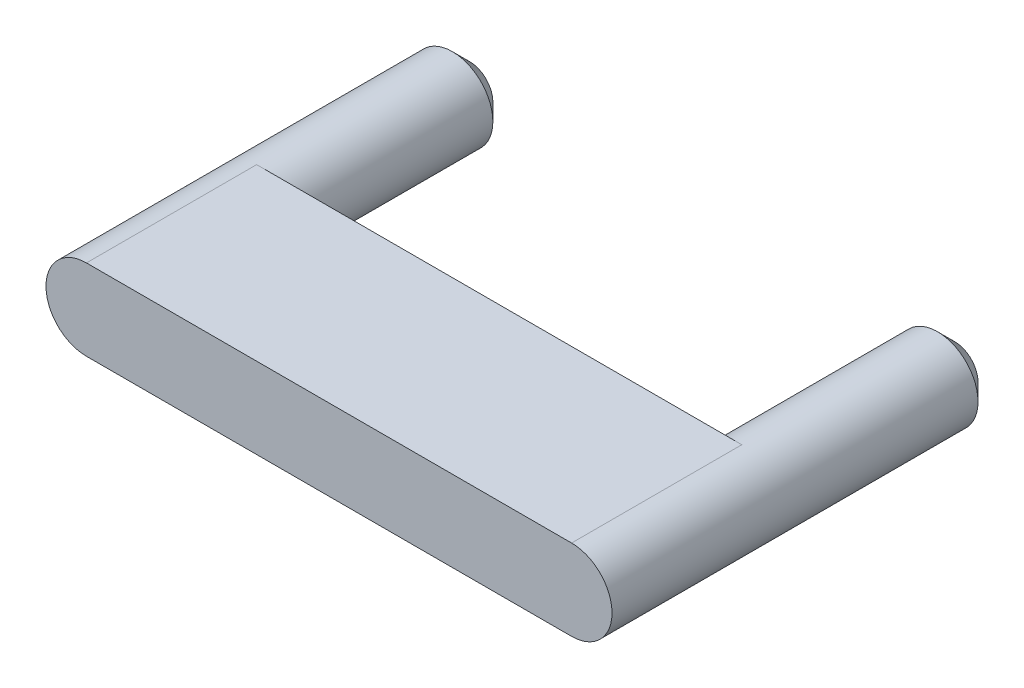
ISO-10303-21;
HEADER;
FILE_DESCRIPTION(('STEP AP214'),'2;1');
FILE_NAME('part.step','',(''),(''),'','','');
FILE_SCHEMA(('AUTOMOTIVE_DESIGN { 1 0 10303 214 1 1 1 1 }'));
ENDSEC;
DATA;
#1=APPLICATION_CONTEXT('core data for automotive mechanical design processes');
#2=APPLICATION_PROTOCOL_DEFINITION('international standard','automotive_design',2000,#1);
#3=PRODUCT_CONTEXT('',#1,'mechanical');
#4=PRODUCT('Part','Part','',(#3));
#5=PRODUCT_RELATED_PRODUCT_CATEGORY('part','',(#4));
#6=PRODUCT_DEFINITION_FORMATION('','',#4);
#7=PRODUCT_DEFINITION_CONTEXT('part definition',#1,'design');
#8=PRODUCT_DEFINITION('design','',#6,#7);
#9=PRODUCT_DEFINITION_SHAPE('','',#8);
#10=(LENGTH_UNIT() NAMED_UNIT(*) SI_UNIT(.MILLI.,.METRE.));
#11=(NAMED_UNIT(*) PLANE_ANGLE_UNIT() SI_UNIT($,.RADIAN.));
#12=(NAMED_UNIT(*) SI_UNIT($,.STERADIAN.) SOLID_ANGLE_UNIT());
#13=UNCERTAINTY_MEASURE_WITH_UNIT(LENGTH_MEASURE(1.E-05),#10,'distance_accuracy_value','');
#14=(GEOMETRIC_REPRESENTATION_CONTEXT(3) GLOBAL_UNCERTAINTY_ASSIGNED_CONTEXT((#13)) GLOBAL_UNIT_ASSIGNED_CONTEXT((#10,
#11,#12)) REPRESENTATION_CONTEXT('',''));
#15=CARTESIAN_POINT('',(0.,0.,0.));
#16=DIRECTION('',(0.,0.,1.));
#17=DIRECTION('',(1.,0.,0.));
#18=AXIS2_PLACEMENT_3D('',#15,#16,#17);
#19=CARTESIAN_POINT('',(0.,-0.949999999999999,4.));
#20=DIRECTION('',(0.,-1.,0.));
#21=DIRECTION('',(0.,0.,-1.));
#22=AXIS2_PLACEMENT_3D('',#19,#20,#21);
#23=PLANE('',#22);
#24=DIRECTION('',(-1.,0.,0.));
#25=VECTOR('',#24,1.);
#26=CARTESIAN_POINT('',(0.,-0.949999999999999,0.));
#27=LINE('',#26,#25);
#28=CARTESIAN_POINT('',(11.4,-0.949999999999999,0.));
#29=VERTEX_POINT('',#28);
#30=CARTESIAN_POINT('',(0.,-0.95,0.));
#31=VERTEX_POINT('',#30);
#32=EDGE_CURVE('E113',#29,#31,#27,.T.);
#33=ORIENTED_EDGE('',*,*,#32,.F.);
#34=DIRECTION('',(0.,0.,-1.));
#35=VECTOR('',#34,1.);
#36=CARTESIAN_POINT('',(11.4,-0.949999999999999,4.));
#37=LINE('',#36,#35);
#38=CARTESIAN_POINT('',(11.4,-0.949999999999999,4.));
#39=VERTEX_POINT('',#38);
#40=EDGE_CURVE('E102',#39,#29,#37,.T.);
#41=ORIENTED_EDGE('',*,*,#40,.F.);
#42=DIRECTION('',(-1.,0.,0.));
#43=VECTOR('',#42,1.);
#44=CARTESIAN_POINT('',(0.,-0.949999999999999,4.));
#45=LINE('',#44,#43);
#46=CARTESIAN_POINT('',(0.,-0.949999999999999,4.));
#47=VERTEX_POINT('',#46);
#48=EDGE_CURVE('E93',#39,#47,#45,.T.);
#49=ORIENTED_EDGE('',*,*,#48,.T.);
#50=DIRECTION('',(0.,0.,-1.));
#51=VECTOR('',#50,1.);
#52=CARTESIAN_POINT('',(0.,-0.949999999999999,4.));
#53=LINE('',#52,#51);
#54=EDGE_CURVE('E109',#47,#31,#53,.T.);
#55=ORIENTED_EDGE('',*,*,#54,.T.);
#56=EDGE_LOOP('',(#33,#41,#49,#55));
#57=FACE_BOUND('',#56,.T.);
#58=ADVANCED_FACE('F41',(#57),#23,.T.);
#59=CARTESIAN_POINT('',(11.4,0.,4.));
#60=DIRECTION('',(0.,0.,-1.));
#61=DIRECTION('',(-1.,0.,0.));
#62=AXIS2_PLACEMENT_3D('',#59,#60,#61);
#63=CYLINDRICAL_SURFACE('',#62,0.949999999999999);
#64=CARTESIAN_POINT('',(11.4,0.,-4.6));
#65=DIRECTION('',(0.,0.,1.));
#66=DIRECTION('',(1.,0.,0.));
#67=AXIS2_PLACEMENT_3D('',#64,#65,#66);
#68=CIRCLE('',#67,0.949999999999999);
#69=CARTESIAN_POINT('',(12.35,0.,-4.6));
#70=VERTEX_POINT('',#69);
#71=EDGE_CURVE('E51',#70,#70,#68,.T.);
#72=ORIENTED_EDGE('',*,*,#71,.T.);
#73=EDGE_LOOP('',(#72));
#74=FACE_BOUND('',#73,.T.);
#75=ORIENTED_EDGE('',*,*,#40,.T.);
#76=CARTESIAN_POINT('',(11.4,0.,0.));
#77=DIRECTION('',(0.,0.,1.));
#78=DIRECTION('',(1.,0.,0.));
#79=AXIS2_PLACEMENT_3D('',#76,#77,#78);
#80=CIRCLE('',#79,0.949999999999999);
#81=CARTESIAN_POINT('',(11.4,0.949999999999999,0.));
#82=VERTEX_POINT('',#81);
#83=EDGE_CURVE('E71',#82,#29,#80,.T.);
#84=ORIENTED_EDGE('',*,*,#83,.F.);
#85=DIRECTION('',(0.,0.,-1.));
#86=VECTOR('',#85,1.);
#87=CARTESIAN_POINT('',(11.4,0.949999999999999,4.));
#88=LINE('',#87,#86);
#89=CARTESIAN_POINT('',(11.4,0.949999999999999,4.));
#90=VERTEX_POINT('',#89);
#91=EDGE_CURVE('E96',#90,#82,#88,.T.);
#92=ORIENTED_EDGE('',*,*,#91,.F.);
#93=CARTESIAN_POINT('',(11.4,0.,4.));
#94=DIRECTION('',(0.,0.,1.));
#95=DIRECTION('',(1.,0.,0.));
#96=AXIS2_PLACEMENT_3D('',#93,#94,#95);
#97=CIRCLE('',#96,0.949999999999999);
#98=EDGE_CURVE('E87',#39,#90,#97,.T.);
#99=ORIENTED_EDGE('',*,*,#98,.F.);
#100=EDGE_LOOP('',(#75,#84,#92,#99));
#101=FACE_BOUND('',#100,.T.);
#102=ADVANCED_FACE('F97',(#74,#101),#63,.T.);
#103=CARTESIAN_POINT('',(0.,0.949999999999999,4.));
#104=DIRECTION('',(0.,-1.,0.));
#105=DIRECTION('',(0.,0.,-1.));
#106=AXIS2_PLACEMENT_3D('',#103,#104,#105);
#107=PLANE('',#106);
#108=DIRECTION('',(-1.,0.,0.));
#109=VECTOR('',#108,1.);
#110=CARTESIAN_POINT('',(0.,0.949999999999999,0.));
#111=LINE('',#110,#109);
#112=CARTESIAN_POINT('',(0.,0.949999999999999,0.));
#113=VERTEX_POINT('',#112);
#114=EDGE_CURVE('E117',#82,#113,#111,.T.);
#115=ORIENTED_EDGE('',*,*,#114,.T.);
#116=DIRECTION('',(0.,0.,-1.));
#117=VECTOR('',#116,1.);
#118=CARTESIAN_POINT('',(0.,0.949999999999999,4.));
#119=LINE('',#118,#117);
#120=CARTESIAN_POINT('',(0.,0.949999999999999,4.));
#121=VERTEX_POINT('',#120);
#122=EDGE_CURVE('E103',#121,#113,#119,.T.);
#123=ORIENTED_EDGE('',*,*,#122,.F.);
#124=DIRECTION('',(-1.,0.,0.));
#125=VECTOR('',#124,1.);
#126=CARTESIAN_POINT('',(0.,0.949999999999999,4.));
#127=LINE('',#126,#125);
#128=EDGE_CURVE('E90',#90,#121,#127,.T.);
#129=ORIENTED_EDGE('',*,*,#128,.F.);
#130=ORIENTED_EDGE('',*,*,#91,.T.);
#131=EDGE_LOOP('',(#115,#123,#129,#130));
#132=FACE_BOUND('',#131,.T.);
#133=ADVANCED_FACE('F105',(#132),#107,.F.);
#134=CARTESIAN_POINT('',(0.,0.,4.));
#135=DIRECTION('',(0.,0.,-1.));
#136=DIRECTION('',(-1.,0.,0.));
#137=AXIS2_PLACEMENT_3D('',#134,#135,#136);
#138=CYLINDRICAL_SURFACE('',#137,0.95);
#139=CARTESIAN_POINT('',(0.,0.,-4.6));
#140=DIRECTION('',(0.,0.,1.));
#141=DIRECTION('',(1.,0.,0.));
#142=AXIS2_PLACEMENT_3D('',#139,#140,#141);
#143=CIRCLE('',#142,0.95);
#144=CARTESIAN_POINT('',(0.95,0.,-4.6));
#145=VERTEX_POINT('',#144);
#146=EDGE_CURVE('E126',#145,#145,#143,.T.);
#147=ORIENTED_EDGE('',*,*,#146,.T.);
#148=EDGE_LOOP('',(#147));
#149=FACE_BOUND('',#148,.T.);
#150=ORIENTED_EDGE('',*,*,#122,.T.);
#151=CARTESIAN_POINT('',(0.,0.,0.));
#152=DIRECTION('',(0.,0.,1.));
#153=DIRECTION('',(1.,0.,0.));
#154=AXIS2_PLACEMENT_3D('',#151,#152,#153);
#155=CIRCLE('',#154,0.95);
#156=EDGE_CURVE('E80',#31,#113,#155,.T.);
#157=ORIENTED_EDGE('',*,*,#156,.F.);
#158=ORIENTED_EDGE('',*,*,#54,.F.);
#159=CARTESIAN_POINT('',(0.,0.,4.));
#160=DIRECTION('',(0.,0.,1.));
#161=DIRECTION('',(1.,0.,0.));
#162=AXIS2_PLACEMENT_3D('',#159,#160,#161);
#163=CIRCLE('',#162,0.95);
#164=EDGE_CURVE('E59',#121,#47,#163,.T.);
#165=ORIENTED_EDGE('',*,*,#164,.F.);
#166=EDGE_LOOP('',(#150,#157,#158,#165));
#167=FACE_BOUND('',#166,.T.);
#168=ADVANCED_FACE('F158',(#149,#167),#138,.T.);
#169=CARTESIAN_POINT('',(0.,0.,4.));
#170=DIRECTION('',(0.,0.,1.));
#171=DIRECTION('',(1.,0.,0.));
#172=AXIS2_PLACEMENT_3D('',#169,#170,#171);
#173=PLANE('',#172);
#174=ORIENTED_EDGE('',*,*,#48,.F.);
#175=ORIENTED_EDGE('',*,*,#98,.T.);
#176=ORIENTED_EDGE('',*,*,#128,.T.);
#177=ORIENTED_EDGE('',*,*,#164,.T.);
#178=EDGE_LOOP('',(#174,#175,#176,#177));
#179=FACE_BOUND('',#178,.T.);
#180=ADVANCED_FACE('F88',(#179),#173,.T.);
#181=CARTESIAN_POINT('',(0.,0.,0.));
#182=DIRECTION('',(0.,0.,1.));
#183=DIRECTION('',(1.,0.,0.));
#184=AXIS2_PLACEMENT_3D('',#181,#182,#183);
#185=PLANE('',#184);
#186=ORIENTED_EDGE('',*,*,#114,.F.);
#187=ORIENTED_EDGE('',*,*,#83,.T.);
#188=ORIENTED_EDGE('',*,*,#32,.T.);
#189=ORIENTED_EDGE('',*,*,#156,.T.);
#190=EDGE_LOOP('',(#186,#187,#188,#189));
#191=FACE_BOUND('',#190,.T.);
#192=ADVANCED_FACE('F162',(#191),#185,.F.);
#193=CARTESIAN_POINT('',(0.,0.,-5.));
#194=DIRECTION('',(0.,0.,1.));
#195=DIRECTION('',(1.,0.,0.));
#196=AXIS2_PLACEMENT_3D('',#193,#194,#195);
#197=PLANE('',#196);
#198=CARTESIAN_POINT('',(0.,0.,-5.));
#199=DIRECTION('',(0.,0.,1.));
#200=DIRECTION('',(1.,0.,0.));
#201=AXIS2_PLACEMENT_3D('',#198,#199,#200);
#202=CIRCLE('',#201,0.549999999999996);
#203=CARTESIAN_POINT('',(0.549999999999996,0.,-5.));
#204=VERTEX_POINT('',#203);
#205=EDGE_CURVE('E130',#204,#204,#202,.F.);
#206=ORIENTED_EDGE('',*,*,#205,.T.);
#207=EDGE_LOOP('',(#206));
#208=FACE_BOUND('',#207,.T.);
#209=ADVANCED_FACE('F165',(#208),#197,.F.);
#210=CARTESIAN_POINT('',(11.4,0.,-5.));
#211=DIRECTION('',(0.,0.,1.));
#212=DIRECTION('',(1.,0.,0.));
#213=AXIS2_PLACEMENT_3D('',#210,#211,#212);
#214=PLANE('',#213);
#215=CARTESIAN_POINT('',(11.4,0.,-5.));
#216=DIRECTION('',(0.,0.,1.));
#217=DIRECTION('',(1.,0.,0.));
#218=AXIS2_PLACEMENT_3D('',#215,#216,#217);
#219=CIRCLE('',#218,0.549999999999997);
#220=CARTESIAN_POINT('',(11.95,0.,-5.));
#221=VERTEX_POINT('',#220);
#222=EDGE_CURVE('E11',#221,#221,#219,.F.);
#223=ORIENTED_EDGE('',*,*,#222,.T.);
#224=EDGE_LOOP('',(#223));
#225=FACE_BOUND('',#224,.T.);
#226=ADVANCED_FACE('F144',(#225),#214,.F.);
#227=CARTESIAN_POINT('',(0.,0.,-4.6));
#228=DIRECTION('',(0.,0.,1.));
#229=DIRECTION('',(1.,0.,0.));
#230=AXIS2_PLACEMENT_3D('',#227,#228,#229);
#231=CONICAL_SURFACE('',#230,0.95,0.785398163397449);
#232=ORIENTED_EDGE('',*,*,#205,.F.);
#233=EDGE_LOOP('',(#232));
#234=FACE_BOUND('',#233,.T.);
#235=ORIENTED_EDGE('',*,*,#146,.F.);
#236=EDGE_LOOP('',(#235));
#237=FACE_BOUND('',#236,.T.);
#238=ADVANCED_FACE('F139',(#234,#237),#231,.T.);
#239=CARTESIAN_POINT('',(11.4,0.,-4.6));
#240=DIRECTION('',(0.,0.,1.));
#241=DIRECTION('',(1.,0.,0.));
#242=AXIS2_PLACEMENT_3D('',#239,#240,#241);
#243=CONICAL_SURFACE('',#242,0.949999999999999,0.785398163397448);
#244=ORIENTED_EDGE('',*,*,#222,.F.);
#245=EDGE_LOOP('',(#244));
#246=FACE_BOUND('',#245,.T.);
#247=ORIENTED_EDGE('',*,*,#71,.F.);
#248=EDGE_LOOP('',(#247));
#249=FACE_BOUND('',#248,.T.);
#250=ADVANCED_FACE('F43',(#246,#249),#243,.T.);
#251=CLOSED_SHELL('',(#58,#102,#133,#168,#180,#192,#209,#226,#238,#250));
#252=MANIFOLD_SOLID_BREP('B2',#251);
#253=ADVANCED_BREP_SHAPE_REPRESENTATION('',(#18,#252),#14);
#254=SHAPE_DEFINITION_REPRESENTATION(#9,#253);
ENDSEC;
END-ISO-10303-21;
